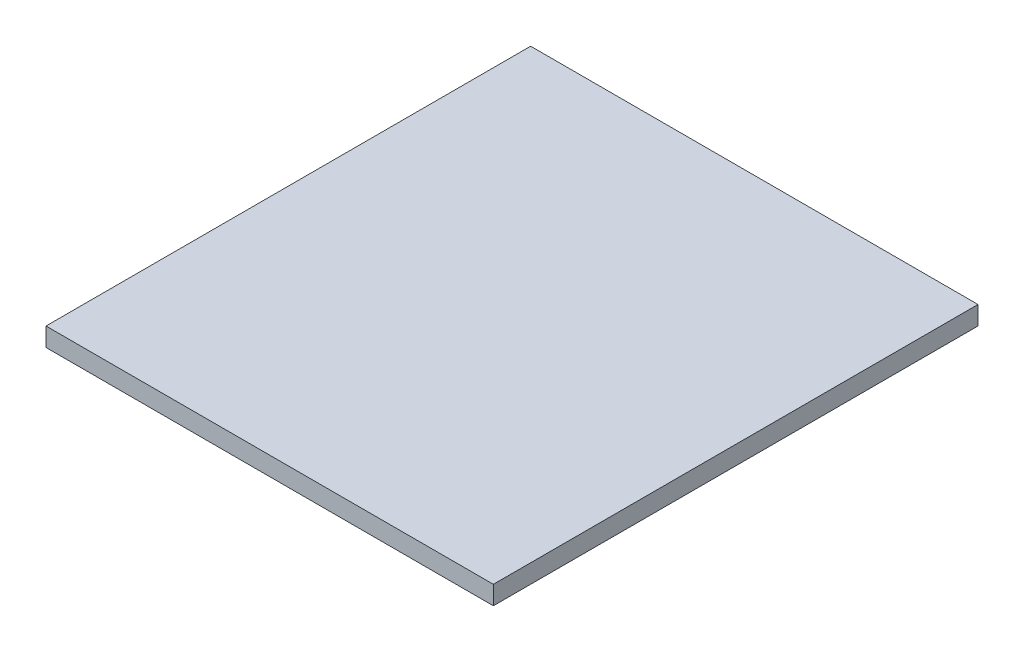
ISO-10303-21;
HEADER;
FILE_DESCRIPTION(('STEP AP214'),'2;1');
FILE_NAME('part.step','',(''),(''),'','','');
FILE_SCHEMA(('AUTOMOTIVE_DESIGN { 1 0 10303 214 1 1 1 1 }'));
ENDSEC;
DATA;
#1=APPLICATION_CONTEXT('core data for automotive mechanical design processes');
#2=APPLICATION_PROTOCOL_DEFINITION('international standard','automotive_design',2000,#1);
#3=PRODUCT_CONTEXT('',#1,'mechanical');
#4=PRODUCT('Part','Part','',(#3));
#5=PRODUCT_RELATED_PRODUCT_CATEGORY('part','',(#4));
#6=PRODUCT_DEFINITION_FORMATION('','',#4);
#7=PRODUCT_DEFINITION_CONTEXT('part definition',#1,'design');
#8=PRODUCT_DEFINITION('design','',#6,#7);
#9=PRODUCT_DEFINITION_SHAPE('','',#8);
#10=(LENGTH_UNIT() NAMED_UNIT(*) SI_UNIT(.MILLI.,.METRE.));
#11=(NAMED_UNIT(*) PLANE_ANGLE_UNIT() SI_UNIT($,.RADIAN.));
#12=(NAMED_UNIT(*) SI_UNIT($,.STERADIAN.) SOLID_ANGLE_UNIT());
#13=UNCERTAINTY_MEASURE_WITH_UNIT(LENGTH_MEASURE(1.E-05),#10,'distance_accuracy_value','');
#14=(GEOMETRIC_REPRESENTATION_CONTEXT(3) GLOBAL_UNCERTAINTY_ASSIGNED_CONTEXT((#13)) GLOBAL_UNIT_ASSIGNED_CONTEXT((#10,
#11,#12)) REPRESENTATION_CONTEXT('',''));
#15=CARTESIAN_POINT('',(0.,0.,0.));
#16=DIRECTION('',(0.,0.,1.));
#17=DIRECTION('',(1.,0.,0.));
#18=AXIS2_PLACEMENT_3D('',#15,#16,#17);
#19=CARTESIAN_POINT('',(0.,12.7,0.));
#20=DIRECTION('',(1.,0.,0.));
#21=DIRECTION('',(0.,0.,-1.));
#22=AXIS2_PLACEMENT_3D('',#19,#20,#21);
#23=PLANE('',#22);
#24=DIRECTION('',(0.,0.,1.));
#25=VECTOR('',#24,1.);
#26=CARTESIAN_POINT('',(0.,0.,0.));
#27=LINE('',#26,#25);
#28=CARTESIAN_POINT('',(0.,0.,-330.2));
#29=VERTEX_POINT('',#28);
#30=CARTESIAN_POINT('',(0.,0.,0.));
#31=VERTEX_POINT('',#30);
#32=EDGE_CURVE('E95',#29,#31,#27,.T.);
#33=ORIENTED_EDGE('',*,*,#32,.T.);
#34=DIRECTION('',(0.,-1.,0.));
#35=VECTOR('',#34,1.);
#36=CARTESIAN_POINT('',(0.,12.7,0.));
#37=LINE('',#36,#35);
#38=CARTESIAN_POINT('',(0.,12.7,0.));
#39=VERTEX_POINT('',#38);
#40=EDGE_CURVE('E11',#39,#31,#37,.T.);
#41=ORIENTED_EDGE('',*,*,#40,.F.);
#42=DIRECTION('',(0.,0.,1.));
#43=VECTOR('',#42,1.);
#44=CARTESIAN_POINT('',(0.,12.7,0.));
#45=LINE('',#44,#43);
#46=CARTESIAN_POINT('',(0.,12.7,-330.2));
#47=VERTEX_POINT('',#46);
#48=EDGE_CURVE('E83',#47,#39,#45,.T.);
#49=ORIENTED_EDGE('',*,*,#48,.F.);
#50=DIRECTION('',(0.,-1.,0.));
#51=VECTOR('',#50,1.);
#52=CARTESIAN_POINT('',(0.,12.7,-330.2));
#53=LINE('',#52,#51);
#54=EDGE_CURVE('E91',#47,#29,#53,.T.);
#55=ORIENTED_EDGE('',*,*,#54,.T.);
#56=EDGE_LOOP('',(#33,#41,#49,#55));
#57=FACE_BOUND('',#56,.T.);
#58=ADVANCED_FACE('F32',(#57),#23,.F.);
#59=CARTESIAN_POINT('',(0.,12.7,0.));
#60=DIRECTION('',(0.,0.,-1.));
#61=DIRECTION('',(-1.,0.,0.));
#62=AXIS2_PLACEMENT_3D('',#59,#60,#61);
#63=PLANE('',#62);
#64=DIRECTION('',(1.,0.,0.));
#65=VECTOR('',#64,1.);
#66=CARTESIAN_POINT('',(0.,0.,0.));
#67=LINE('',#66,#65);
#68=CARTESIAN_POINT('',(304.8,0.,0.));
#69=VERTEX_POINT('',#68);
#70=EDGE_CURVE('E87',#31,#69,#67,.T.);
#71=ORIENTED_EDGE('',*,*,#70,.T.);
#72=DIRECTION('',(0.,-1.,0.));
#73=VECTOR('',#72,1.);
#74=CARTESIAN_POINT('',(304.8,12.7,0.));
#75=LINE('',#74,#73);
#76=CARTESIAN_POINT('',(304.8,12.7,0.));
#77=VERTEX_POINT('',#76);
#78=EDGE_CURVE('E40',#77,#69,#75,.T.);
#79=ORIENTED_EDGE('',*,*,#78,.F.);
#80=DIRECTION('',(1.,0.,0.));
#81=VECTOR('',#80,1.);
#82=CARTESIAN_POINT('',(0.,12.7,0.));
#83=LINE('',#82,#81);
#84=EDGE_CURVE('E78',#39,#77,#83,.T.);
#85=ORIENTED_EDGE('',*,*,#84,.F.);
#86=ORIENTED_EDGE('',*,*,#40,.T.);
#87=EDGE_LOOP('',(#71,#79,#85,#86));
#88=FACE_BOUND('',#87,.T.);
#89=ADVANCED_FACE('F86',(#88),#63,.F.);
#90=CARTESIAN_POINT('',(304.8,12.7,0.));
#91=DIRECTION('',(-1.,0.,0.));
#92=DIRECTION('',(0.,0.,1.));
#93=AXIS2_PLACEMENT_3D('',#90,#91,#92);
#94=PLANE('',#93);
#95=DIRECTION('',(0.,0.,-1.));
#96=VECTOR('',#95,1.);
#97=CARTESIAN_POINT('',(304.8,0.,0.));
#98=LINE('',#97,#96);
#99=CARTESIAN_POINT('',(304.8,0.,-330.2));
#100=VERTEX_POINT('',#99);
#101=EDGE_CURVE('E65',#69,#100,#98,.T.);
#102=ORIENTED_EDGE('',*,*,#101,.T.);
#103=DIRECTION('',(0.,-1.,0.));
#104=VECTOR('',#103,1.);
#105=CARTESIAN_POINT('',(304.8,12.7,-330.2));
#106=LINE('',#105,#104);
#107=CARTESIAN_POINT('',(304.8,12.7,-330.2));
#108=VERTEX_POINT('',#107);
#109=EDGE_CURVE('E88',#108,#100,#106,.T.);
#110=ORIENTED_EDGE('',*,*,#109,.F.);
#111=DIRECTION('',(0.,0.,-1.));
#112=VECTOR('',#111,1.);
#113=CARTESIAN_POINT('',(304.8,12.7,0.));
#114=LINE('',#113,#112);
#115=EDGE_CURVE('E81',#77,#108,#114,.T.);
#116=ORIENTED_EDGE('',*,*,#115,.F.);
#117=ORIENTED_EDGE('',*,*,#78,.T.);
#118=EDGE_LOOP('',(#102,#110,#116,#117));
#119=FACE_BOUND('',#118,.T.);
#120=ADVANCED_FACE('F89',(#119),#94,.F.);
#121=CARTESIAN_POINT('',(0.,12.7,-330.2));
#122=DIRECTION('',(0.,0.,1.));
#123=DIRECTION('',(1.,0.,0.));
#124=AXIS2_PLACEMENT_3D('',#121,#122,#123);
#125=PLANE('',#124);
#126=DIRECTION('',(-1.,0.,0.));
#127=VECTOR('',#126,1.);
#128=CARTESIAN_POINT('',(0.,0.,-330.2));
#129=LINE('',#128,#127);
#130=EDGE_CURVE('E71',#100,#29,#129,.T.);
#131=ORIENTED_EDGE('',*,*,#130,.T.);
#132=ORIENTED_EDGE('',*,*,#54,.F.);
#133=DIRECTION('',(-1.,0.,0.));
#134=VECTOR('',#133,1.);
#135=CARTESIAN_POINT('',(0.,12.7,-330.2));
#136=LINE('',#135,#134);
#137=EDGE_CURVE('E48',#108,#47,#136,.T.);
#138=ORIENTED_EDGE('',*,*,#137,.F.);
#139=ORIENTED_EDGE('',*,*,#109,.T.);
#140=EDGE_LOOP('',(#131,#132,#138,#139));
#141=FACE_BOUND('',#140,.T.);
#142=ADVANCED_FACE('F102',(#141),#125,.F.);
#143=CARTESIAN_POINT('',(0.,12.7,0.));
#144=DIRECTION('',(0.,-1.,0.));
#145=DIRECTION('',(0.,0.,-1.));
#146=AXIS2_PLACEMENT_3D('',#143,#144,#145);
#147=PLANE('',#146);
#148=ORIENTED_EDGE('',*,*,#48,.T.);
#149=ORIENTED_EDGE('',*,*,#84,.T.);
#150=ORIENTED_EDGE('',*,*,#115,.T.);
#151=ORIENTED_EDGE('',*,*,#137,.T.);
#152=EDGE_LOOP('',(#148,#149,#150,#151));
#153=FACE_BOUND('',#152,.T.);
#154=ADVANCED_FACE('F79',(#153),#147,.F.);
#155=CARTESIAN_POINT('',(0.,0.,0.));
#156=DIRECTION('',(0.,-1.,0.));
#157=DIRECTION('',(0.,0.,-1.));
#158=AXIS2_PLACEMENT_3D('',#155,#156,#157);
#159=PLANE('',#158);
#160=ORIENTED_EDGE('',*,*,#32,.F.);
#161=ORIENTED_EDGE('',*,*,#130,.F.);
#162=ORIENTED_EDGE('',*,*,#101,.F.);
#163=ORIENTED_EDGE('',*,*,#70,.F.);
#164=EDGE_LOOP('',(#160,#161,#162,#163));
#165=FACE_BOUND('',#164,.T.);
#166=ADVANCED_FACE('F105',(#165),#159,.T.);
#167=CLOSED_SHELL('',(#58,#89,#120,#142,#154,#166));
#168=MANIFOLD_SOLID_BREP('B2',#167);
#169=ADVANCED_BREP_SHAPE_REPRESENTATION('',(#18,#168),#14);
#170=SHAPE_DEFINITION_REPRESENTATION(#9,#169);
ENDSEC;
END-ISO-10303-21;
